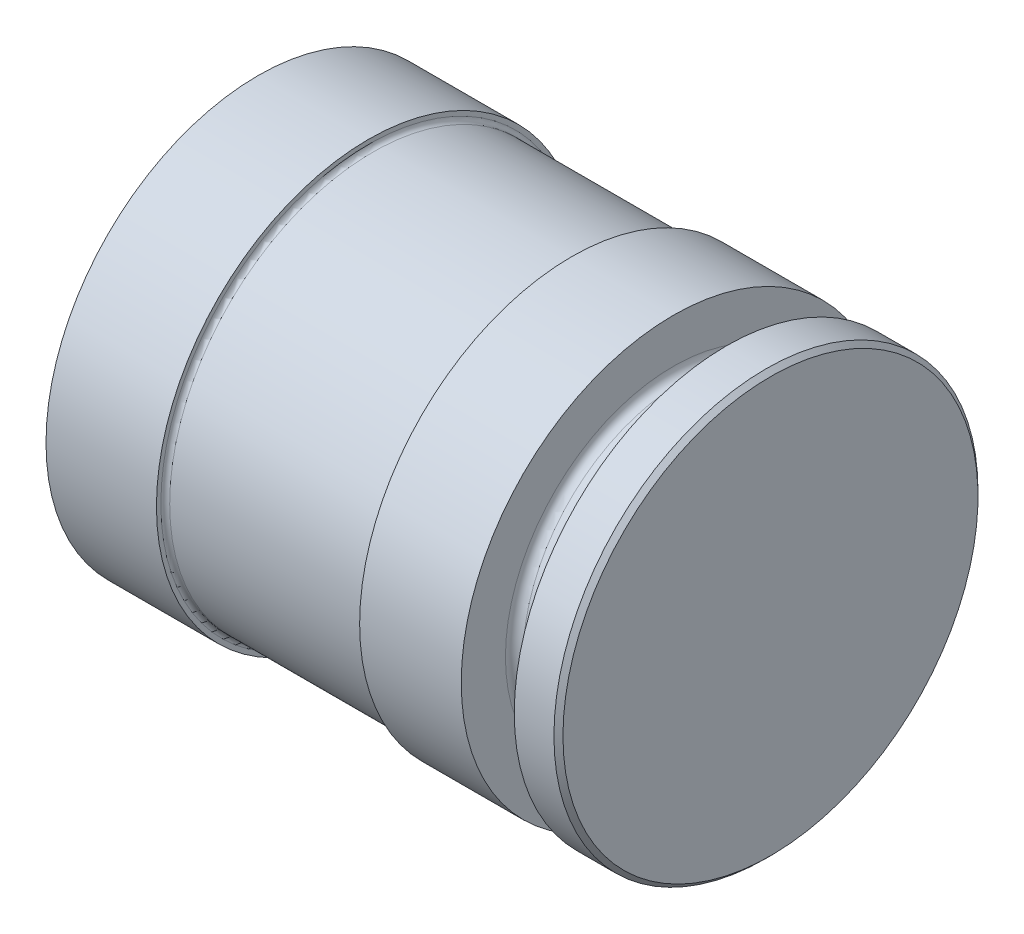
ISO-10303-21;
HEADER;
FILE_DESCRIPTION(('STEP AP214'),'2;1');
FILE_NAME('part.step','',(''),(''),'','','');
FILE_SCHEMA(('AUTOMOTIVE_DESIGN { 1 0 10303 214 1 1 1 1 }'));
ENDSEC;
DATA;
#1=APPLICATION_CONTEXT('core data for automotive mechanical design processes');
#2=APPLICATION_PROTOCOL_DEFINITION('international standard','automotive_design',2000,#1);
#3=PRODUCT_CONTEXT('',#1,'mechanical');
#4=PRODUCT('Part','Part','',(#3));
#5=PRODUCT_RELATED_PRODUCT_CATEGORY('part','',(#4));
#6=PRODUCT_DEFINITION_FORMATION('','',#4);
#7=PRODUCT_DEFINITION_CONTEXT('part definition',#1,'design');
#8=PRODUCT_DEFINITION('design','',#6,#7);
#9=PRODUCT_DEFINITION_SHAPE('','',#8);
#10=(LENGTH_UNIT() NAMED_UNIT(*) SI_UNIT(.MILLI.,.METRE.));
#11=(NAMED_UNIT(*) PLANE_ANGLE_UNIT() SI_UNIT($,.RADIAN.));
#12=(NAMED_UNIT(*) SI_UNIT($,.STERADIAN.) SOLID_ANGLE_UNIT());
#13=UNCERTAINTY_MEASURE_WITH_UNIT(LENGTH_MEASURE(1.E-05),#10,'distance_accuracy_value','');
#14=(GEOMETRIC_REPRESENTATION_CONTEXT(3) GLOBAL_UNCERTAINTY_ASSIGNED_CONTEXT((#13)) GLOBAL_UNIT_ASSIGNED_CONTEXT((#10,
#11,#12)) REPRESENTATION_CONTEXT('',''));
#15=CARTESIAN_POINT('',(0.,0.,0.));
#16=DIRECTION('',(0.,0.,1.));
#17=DIRECTION('',(1.,0.,0.));
#18=AXIS2_PLACEMENT_3D('',#15,#16,#17);
#19=CARTESIAN_POINT('',(30.,11.7444066745266,0.));
#20=DIRECTION('',(-1.,0.,0.));
#21=DIRECTION('',(0.,0.,1.));
#22=AXIS2_PLACEMENT_3D('',#19,#20,#21);
#23=PLANE('',#22);
#24=CARTESIAN_POINT('',(30.,0.,0.));
#25=DIRECTION('',(-1.,0.,0.));
#26=DIRECTION('',(0.,0.,1.));
#27=AXIS2_PLACEMENT_3D('',#24,#25,#26);
#28=CIRCLE('',#27,11.7444066745266);
#29=CARTESIAN_POINT('',(30.,0.,11.7444066745266));
#30=VERTEX_POINT('',#29);
#31=EDGE_CURVE('E10',#30,#30,#28,.T.);
#32=ORIENTED_EDGE('',*,*,#31,.F.);
#33=EDGE_LOOP('',(#32));
#34=FACE_BOUND('',#33,.T.);
#35=ADVANCED_FACE('F348',(#34),#23,.F.);
#36=CARTESIAN_POINT('',(30.,0.,0.));
#37=DIRECTION('',(-1.,0.,0.));
#38=DIRECTION('',(0.,0.,1.));
#39=AXIS2_PLACEMENT_3D('',#36,#37,#38);
#40=CONICAL_SURFACE('',#39,11.7444066745266,0.785398163397445);
#41=CARTESIAN_POINT('',(29.7444066745266,0.,0.));
#42=DIRECTION('',(-1.,0.,0.));
#43=DIRECTION('',(0.,0.,1.));
#44=AXIS2_PLACEMENT_3D('',#41,#42,#43);
#45=CIRCLE('',#44,12.);
#46=CARTESIAN_POINT('',(29.7444066745266,0.,12.));
#47=VERTEX_POINT('',#46);
#48=EDGE_CURVE('E355',#47,#47,#45,.T.);
#49=ORIENTED_EDGE('',*,*,#48,.F.);
#50=EDGE_LOOP('',(#49));
#51=FACE_BOUND('',#50,.T.);
#52=ORIENTED_EDGE('',*,*,#31,.T.);
#53=EDGE_LOOP('',(#52));
#54=FACE_BOUND('',#53,.T.);
#55=ADVANCED_FACE('F489',(#51,#54),#40,.T.);
#56=CARTESIAN_POINT('',(-20.3252049180328,0.,0.));
#57=DIRECTION('',(-1.,0.,0.));
#58=DIRECTION('',(0.,0.,1.));
#59=AXIS2_PLACEMENT_3D('',#56,#57,#58);
#60=CYLINDRICAL_SURFACE('',#59,12.);
#61=CARTESIAN_POINT('',(27.5,0.,0.));
#62=DIRECTION('',(-1.,0.,0.));
#63=DIRECTION('',(0.,0.,1.));
#64=AXIS2_PLACEMENT_3D('',#61,#62,#63);
#65=CIRCLE('',#64,12.);
#66=CARTESIAN_POINT('',(27.5,0.,12.));
#67=VERTEX_POINT('',#66);
#68=EDGE_CURVE('E361',#67,#67,#65,.T.);
#69=ORIENTED_EDGE('',*,*,#68,.F.);
#70=EDGE_LOOP('',(#69));
#71=FACE_BOUND('',#70,.T.);
#72=ORIENTED_EDGE('',*,*,#48,.T.);
#73=EDGE_LOOP('',(#72));
#74=FACE_BOUND('',#73,.T.);
#75=ADVANCED_FACE('F484',(#71,#74),#60,.T.);
#76=CARTESIAN_POINT('',(27.5,9.5,0.));
#77=DIRECTION('',(1.,0.,0.));
#78=DIRECTION('',(0.,0.,-1.));
#79=AXIS2_PLACEMENT_3D('',#76,#77,#78);
#80=PLANE('',#79);
#81=CARTESIAN_POINT('',(27.5,0.,0.));
#82=DIRECTION('',(-1.,0.,0.));
#83=DIRECTION('',(0.,0.,1.));
#84=AXIS2_PLACEMENT_3D('',#81,#82,#83);
#85=CIRCLE('',#84,9.5);
#86=CARTESIAN_POINT('',(27.5,0.,9.5));
#87=VERTEX_POINT('',#86);
#88=EDGE_CURVE('E365',#87,#87,#85,.T.);
#89=ORIENTED_EDGE('',*,*,#88,.F.);
#90=EDGE_LOOP('',(#89));
#91=FACE_BOUND('',#90,.T.);
#92=ORIENTED_EDGE('',*,*,#68,.T.);
#93=EDGE_LOOP('',(#92));
#94=FACE_BOUND('',#93,.T.);
#95=ADVANCED_FACE('F478',(#91,#94),#80,.F.);
#96=CARTESIAN_POINT('',(27.,0.,0.));
#97=DIRECTION('',(-1.,0.,0.));
#98=DIRECTION('',(0.,0.,1.));
#99=AXIS2_PLACEMENT_3D('',#96,#97,#98);
#100=TOROIDAL_SURFACE('',#99,9.5,0.500000000000001);
#101=CARTESIAN_POINT('',(27.,0.,0.));
#102=DIRECTION('',(-1.,0.,0.));
#103=DIRECTION('',(0.,0.,1.));
#104=AXIS2_PLACEMENT_3D('',#101,#102,#103);
#105=CIRCLE('',#104,9.);
#106=CARTESIAN_POINT('',(27.,0.,9.));
#107=VERTEX_POINT('',#106);
#108=EDGE_CURVE('E370',#107,#107,#105,.T.);
#109=ORIENTED_EDGE('',*,*,#108,.F.);
#110=EDGE_LOOP('',(#109));
#111=FACE_BOUND('',#110,.T.);
#112=ORIENTED_EDGE('',*,*,#88,.T.);
#113=EDGE_LOOP('',(#112));
#114=FACE_BOUND('',#113,.T.);
#115=ADVANCED_FACE('F472',(#111,#114),#100,.F.);
#116=CARTESIAN_POINT('',(-20.3252049180328,0.,0.));
#117=DIRECTION('',(-1.,0.,0.));
#118=DIRECTION('',(0.,0.,1.));
#119=AXIS2_PLACEMENT_3D('',#116,#117,#118);
#120=CYLINDRICAL_SURFACE('',#119,9.);
#121=CARTESIAN_POINT('',(25.,0.,0.));
#122=DIRECTION('',(-1.,0.,0.));
#123=DIRECTION('',(0.,0.,1.));
#124=AXIS2_PLACEMENT_3D('',#121,#122,#123);
#125=CIRCLE('',#124,9.);
#126=CARTESIAN_POINT('',(25.,0.,9.));
#127=VERTEX_POINT('',#126);
#128=EDGE_CURVE('E373',#127,#127,#125,.T.);
#129=ORIENTED_EDGE('',*,*,#128,.F.);
#130=EDGE_LOOP('',(#129));
#131=FACE_BOUND('',#130,.T.);
#132=ORIENTED_EDGE('',*,*,#108,.T.);
#133=EDGE_LOOP('',(#132));
#134=FACE_BOUND('',#133,.T.);
#135=ADVANCED_FACE('F466',(#131,#134),#120,.T.);
#136=CARTESIAN_POINT('',(25.,0.,0.));
#137=DIRECTION('',(-1.,0.,0.));
#138=DIRECTION('',(0.,0.,1.));
#139=AXIS2_PLACEMENT_3D('',#136,#137,#138);
#140=TOROIDAL_SURFACE('',#139,9.5,0.5);
#141=CARTESIAN_POINT('',(24.5,0.,0.));
#142=DIRECTION('',(-1.,0.,0.));
#143=DIRECTION('',(0.,0.,1.));
#144=AXIS2_PLACEMENT_3D('',#141,#142,#143);
#145=CIRCLE('',#144,9.5);
#146=CARTESIAN_POINT('',(24.5,0.,9.5));
#147=VERTEX_POINT('',#146);
#148=EDGE_CURVE('E376',#147,#147,#145,.T.);
#149=ORIENTED_EDGE('',*,*,#148,.F.);
#150=EDGE_LOOP('',(#149));
#151=FACE_BOUND('',#150,.T.);
#152=ORIENTED_EDGE('',*,*,#128,.T.);
#153=EDGE_LOOP('',(#152));
#154=FACE_BOUND('',#153,.T.);
#155=ADVANCED_FACE('F460',(#151,#154),#140,.F.);
#156=CARTESIAN_POINT('',(24.5,12.,0.));
#157=DIRECTION('',(-1.,0.,0.));
#158=DIRECTION('',(0.,0.,1.));
#159=AXIS2_PLACEMENT_3D('',#156,#157,#158);
#160=PLANE('',#159);
#161=CARTESIAN_POINT('',(24.5,0.,0.));
#162=DIRECTION('',(-1.,0.,0.));
#163=DIRECTION('',(0.,0.,1.));
#164=AXIS2_PLACEMENT_3D('',#161,#162,#163);
#165=CIRCLE('',#164,12.);
#166=CARTESIAN_POINT('',(24.5,0.,12.));
#167=VERTEX_POINT('',#166);
#168=EDGE_CURVE('E379',#167,#167,#165,.T.);
#169=ORIENTED_EDGE('',*,*,#168,.F.);
#170=EDGE_LOOP('',(#169));
#171=FACE_BOUND('',#170,.T.);
#172=ORIENTED_EDGE('',*,*,#148,.T.);
#173=EDGE_LOOP('',(#172));
#174=FACE_BOUND('',#173,.T.);
#175=ADVANCED_FACE('F454',(#171,#174),#160,.F.);
#176=CARTESIAN_POINT('',(-20.3252049180328,0.,0.));
#177=DIRECTION('',(-1.,0.,0.));
#178=DIRECTION('',(0.,0.,1.));
#179=AXIS2_PLACEMENT_3D('',#176,#177,#178);
#180=CYLINDRICAL_SURFACE('',#179,12.);
#181=CARTESIAN_POINT('',(18.75,0.,0.));
#182=DIRECTION('',(-1.,0.,0.));
#183=DIRECTION('',(0.,0.,1.));
#184=AXIS2_PLACEMENT_3D('',#181,#182,#183);
#185=CIRCLE('',#184,12.);
#186=CARTESIAN_POINT('',(18.75,0.,12.));
#187=VERTEX_POINT('',#186);
#188=EDGE_CURVE('E382',#187,#187,#185,.T.);
#189=ORIENTED_EDGE('',*,*,#188,.F.);
#190=EDGE_LOOP('',(#189));
#191=FACE_BOUND('',#190,.T.);
#192=ORIENTED_EDGE('',*,*,#168,.T.);
#193=EDGE_LOOP('',(#192));
#194=FACE_BOUND('',#193,.T.);
#195=ADVANCED_FACE('F448',(#191,#194),#180,.T.);
#196=CARTESIAN_POINT('',(18.75,11.75,0.));
#197=DIRECTION('',(1.,0.,0.));
#198=DIRECTION('',(0.,0.,-1.));
#199=AXIS2_PLACEMENT_3D('',#196,#197,#198);
#200=PLANE('',#199);
#201=CARTESIAN_POINT('',(18.75,0.,0.));
#202=DIRECTION('',(-1.,0.,0.));
#203=DIRECTION('',(0.,0.,1.));
#204=AXIS2_PLACEMENT_3D('',#201,#202,#203);
#205=CIRCLE('',#204,11.75);
#206=CARTESIAN_POINT('',(18.75,0.,11.75));
#207=VERTEX_POINT('',#206);
#208=EDGE_CURVE('E385',#207,#207,#205,.T.);
#209=ORIENTED_EDGE('',*,*,#208,.F.);
#210=EDGE_LOOP('',(#209));
#211=FACE_BOUND('',#210,.T.);
#212=ORIENTED_EDGE('',*,*,#188,.T.);
#213=EDGE_LOOP('',(#212));
#214=FACE_BOUND('',#213,.T.);
#215=ADVANCED_FACE('F442',(#211,#214),#200,.F.);
#216=CARTESIAN_POINT('',(18.5,0.,0.));
#217=DIRECTION('',(-1.,0.,0.));
#218=DIRECTION('',(0.,0.,1.));
#219=AXIS2_PLACEMENT_3D('',#216,#217,#218);
#220=TOROIDAL_SURFACE('',#219,11.75,0.25);
#221=CARTESIAN_POINT('',(18.5,0.,0.));
#222=DIRECTION('',(-1.,0.,0.));
#223=DIRECTION('',(0.,0.,1.));
#224=AXIS2_PLACEMENT_3D('',#221,#222,#223);
#225=CIRCLE('',#224,11.5);
#226=CARTESIAN_POINT('',(18.5,0.,11.5));
#227=VERTEX_POINT('',#226);
#228=EDGE_CURVE('E388',#227,#227,#225,.T.);
#229=ORIENTED_EDGE('',*,*,#228,.F.);
#230=EDGE_LOOP('',(#229));
#231=FACE_BOUND('',#230,.T.);
#232=ORIENTED_EDGE('',*,*,#208,.T.);
#233=EDGE_LOOP('',(#232));
#234=FACE_BOUND('',#233,.T.);
#235=ADVANCED_FACE('F436',(#231,#234),#220,.F.);
#236=CARTESIAN_POINT('',(-20.3252049180328,0.,0.));
#237=DIRECTION('',(-1.,0.,0.));
#238=DIRECTION('',(0.,0.,1.));
#239=AXIS2_PLACEMENT_3D('',#236,#237,#238);
#240=CYLINDRICAL_SURFACE('',#239,11.5);
#241=CARTESIAN_POINT('',(7.5,0.,0.));
#242=DIRECTION('',(-1.,0.,0.));
#243=DIRECTION('',(0.,0.,1.));
#244=AXIS2_PLACEMENT_3D('',#241,#242,#243);
#245=CIRCLE('',#244,11.5);
#246=CARTESIAN_POINT('',(7.5,0.,11.5));
#247=VERTEX_POINT('',#246);
#248=EDGE_CURVE('E391',#247,#247,#245,.T.);
#249=ORIENTED_EDGE('',*,*,#248,.F.);
#250=EDGE_LOOP('',(#249));
#251=FACE_BOUND('',#250,.T.);
#252=ORIENTED_EDGE('',*,*,#228,.T.);
#253=EDGE_LOOP('',(#252));
#254=FACE_BOUND('',#253,.T.);
#255=ADVANCED_FACE('F430',(#251,#254),#240,.T.);
#256=CARTESIAN_POINT('',(7.5,0.,0.));
#257=DIRECTION('',(-1.,0.,0.));
#258=DIRECTION('',(0.,0.,1.));
#259=AXIS2_PLACEMENT_3D('',#256,#257,#258);
#260=TOROIDAL_SURFACE('',#259,11.75,0.25);
#261=CARTESIAN_POINT('',(7.25,0.,0.));
#262=DIRECTION('',(-1.,0.,0.));
#263=DIRECTION('',(0.,0.,1.));
#264=AXIS2_PLACEMENT_3D('',#261,#262,#263);
#265=CIRCLE('',#264,11.75);
#266=CARTESIAN_POINT('',(7.25,0.,11.75));
#267=VERTEX_POINT('',#266);
#268=EDGE_CURVE('E394',#267,#267,#265,.T.);
#269=ORIENTED_EDGE('',*,*,#268,.F.);
#270=EDGE_LOOP('',(#269));
#271=FACE_BOUND('',#270,.T.);
#272=ORIENTED_EDGE('',*,*,#248,.T.);
#273=EDGE_LOOP('',(#272));
#274=FACE_BOUND('',#273,.T.);
#275=ADVANCED_FACE('F424',(#271,#274),#260,.F.);
#276=CARTESIAN_POINT('',(7.25,12.,0.));
#277=DIRECTION('',(-1.,0.,0.));
#278=DIRECTION('',(0.,0.,1.));
#279=AXIS2_PLACEMENT_3D('',#276,#277,#278);
#280=PLANE('',#279);
#281=CARTESIAN_POINT('',(7.25,0.,0.));
#282=DIRECTION('',(-1.,0.,0.));
#283=DIRECTION('',(0.,0.,1.));
#284=AXIS2_PLACEMENT_3D('',#281,#282,#283);
#285=CIRCLE('',#284,12.);
#286=CARTESIAN_POINT('',(7.25,0.,12.));
#287=VERTEX_POINT('',#286);
#288=EDGE_CURVE('E397',#287,#287,#285,.T.);
#289=ORIENTED_EDGE('',*,*,#288,.F.);
#290=EDGE_LOOP('',(#289));
#291=FACE_BOUND('',#290,.T.);
#292=ORIENTED_EDGE('',*,*,#268,.T.);
#293=EDGE_LOOP('',(#292));
#294=FACE_BOUND('',#293,.T.);
#295=ADVANCED_FACE('F418',(#291,#294),#280,.F.);
#296=CARTESIAN_POINT('',(-20.3252049180328,0.,0.));
#297=DIRECTION('',(-1.,0.,0.));
#298=DIRECTION('',(0.,0.,1.));
#299=AXIS2_PLACEMENT_3D('',#296,#297,#298);
#300=CYLINDRICAL_SURFACE('',#299,12.);
#301=CARTESIAN_POINT('',(1.,0.,0.));
#302=DIRECTION('',(-1.,0.,0.));
#303=DIRECTION('',(0.,0.,1.));
#304=AXIS2_PLACEMENT_3D('',#301,#302,#303);
#305=CIRCLE('',#304,12.);
#306=CARTESIAN_POINT('',(1.,0.,12.));
#307=VERTEX_POINT('',#306);
#308=EDGE_CURVE('E400',#307,#307,#305,.T.);
#309=ORIENTED_EDGE('',*,*,#308,.F.);
#310=EDGE_LOOP('',(#309));
#311=FACE_BOUND('',#310,.T.);
#312=ORIENTED_EDGE('',*,*,#288,.T.);
#313=EDGE_LOOP('',(#312));
#314=FACE_BOUND('',#313,.T.);
#315=ADVANCED_FACE('F412',(#311,#314),#300,.T.);
#316=CARTESIAN_POINT('',(1.,0.,0.));
#317=DIRECTION('',(1.,0.,0.));
#318=DIRECTION('',(0.,0.,-1.));
#319=AXIS2_PLACEMENT_3D('',#316,#317,#318);
#320=CONICAL_SURFACE('',#319,12.,1.0471975511966);
#321=CARTESIAN_POINT('',(0.,0.,0.));
#322=DIRECTION('',(-1.,0.,0.));
#323=DIRECTION('',(0.,0.,1.));
#324=AXIS2_PLACEMENT_3D('',#321,#322,#323);
#325=CIRCLE('',#324,10.2679491924311);
#326=CARTESIAN_POINT('',(0.,0.,10.2679491924311));
#327=VERTEX_POINT('',#326);
#328=EDGE_CURVE('E403',#327,#327,#325,.T.);
#329=ORIENTED_EDGE('',*,*,#328,.F.);
#330=EDGE_LOOP('',(#329));
#331=FACE_BOUND('',#330,.T.);
#332=ORIENTED_EDGE('',*,*,#308,.T.);
#333=EDGE_LOOP('',(#332));
#334=FACE_BOUND('',#333,.T.);
#335=ADVANCED_FACE('F409',(#331,#334),#320,.T.);
#336=CARTESIAN_POINT('',(0.,0.,0.));
#337=DIRECTION('',(1.,0.,0.));
#338=DIRECTION('',(0.,0.,-1.));
#339=AXIS2_PLACEMENT_3D('',#336,#337,#338);
#340=PLANE('',#339);
#341=ORIENTED_EDGE('',*,*,#328,.T.);
#342=EDGE_LOOP('',(#341));
#343=FACE_BOUND('',#342,.T.);
#344=ADVANCED_FACE('F407',(#343),#340,.F.);
#345=CLOSED_SHELL('',(#35,#55,#75,#95,#115,#135,#155,#175,#195,#215,#235,#255,#275,#295,#315,
#335,#344));
#346=MANIFOLD_SOLID_BREP('B2',#345);
#347=ADVANCED_BREP_SHAPE_REPRESENTATION('',(#18,#346),#14);
#348=SHAPE_DEFINITION_REPRESENTATION(#9,#347);
ENDSEC;
END-ISO-10303-21;
